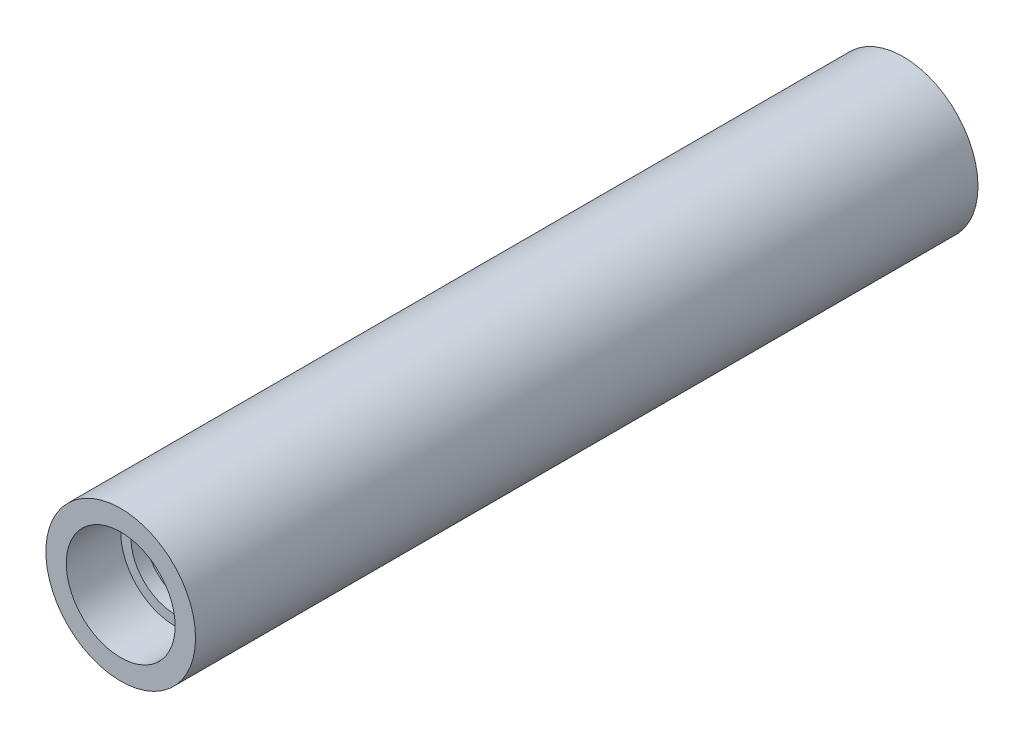
ISO-10303-21;
HEADER;
FILE_DESCRIPTION(('STEP AP214'),'2;1');
FILE_NAME('part.step','',(''),(''),'','','');
FILE_SCHEMA(('AUTOMOTIVE_DESIGN { 1 0 10303 214 1 1 1 1 }'));
ENDSEC;
DATA;
#1=APPLICATION_CONTEXT('core data for automotive mechanical design processes');
#2=APPLICATION_PROTOCOL_DEFINITION('international standard','automotive_design',2000,#1);
#3=PRODUCT_CONTEXT('',#1,'mechanical');
#4=PRODUCT('Part','Part','',(#3));
#5=PRODUCT_RELATED_PRODUCT_CATEGORY('part','',(#4));
#6=PRODUCT_DEFINITION_FORMATION('','',#4);
#7=PRODUCT_DEFINITION_CONTEXT('part definition',#1,'design');
#8=PRODUCT_DEFINITION('design','',#6,#7);
#9=PRODUCT_DEFINITION_SHAPE('','',#8);
#10=(LENGTH_UNIT() NAMED_UNIT(*) SI_UNIT(.MILLI.,.METRE.));
#11=(NAMED_UNIT(*) PLANE_ANGLE_UNIT() SI_UNIT($,.RADIAN.));
#12=(NAMED_UNIT(*) SI_UNIT($,.STERADIAN.) SOLID_ANGLE_UNIT());
#13=UNCERTAINTY_MEASURE_WITH_UNIT(LENGTH_MEASURE(1.E-05),#10,'distance_accuracy_value','');
#14=(GEOMETRIC_REPRESENTATION_CONTEXT(3) GLOBAL_UNCERTAINTY_ASSIGNED_CONTEXT((#13)) GLOBAL_UNIT_ASSIGNED_CONTEXT((#10,
#11,#12)) REPRESENTATION_CONTEXT('',''));
#15=CARTESIAN_POINT('',(0.,0.,0.));
#16=DIRECTION('',(0.,0.,1.));
#17=DIRECTION('',(1.,0.,0.));
#18=AXIS2_PLACEMENT_3D('',#15,#16,#17);
#19=CARTESIAN_POINT('',(0.,0.,57.5));
#20=DIRECTION('',(0.,0.,-1.));
#21=DIRECTION('',(-1.,0.,0.));
#22=AXIS2_PLACEMENT_3D('',#19,#20,#21);
#23=CYLINDRICAL_SURFACE('',#22,8.);
#24=CARTESIAN_POINT('',(0.,0.,47.5));
#25=DIRECTION('',(0.,0.,1.));
#26=DIRECTION('',(1.,0.,0.));
#27=AXIS2_PLACEMENT_3D('',#24,#25,#26);
#28=CIRCLE('',#27,8.);
#29=CARTESIAN_POINT('',(8.,0.,47.5));
#30=VERTEX_POINT('',#29);
#31=EDGE_CURVE('E64',#30,#30,#28,.T.);
#32=ORIENTED_EDGE('',*,*,#31,.T.);
#33=EDGE_LOOP('',(#32));
#34=FACE_BOUND('',#33,.T.);
#35=CARTESIAN_POINT('',(0.,0.,-47.5));
#36=DIRECTION('',(0.,0.,1.));
#37=DIRECTION('',(1.,0.,0.));
#38=AXIS2_PLACEMENT_3D('',#35,#36,#37);
#39=CIRCLE('',#38,8.);
#40=CARTESIAN_POINT('',(8.,0.,-47.5));
#41=VERTEX_POINT('',#40);
#42=EDGE_CURVE('E69',#41,#41,#39,.T.);
#43=ORIENTED_EDGE('',*,*,#42,.F.);
#44=EDGE_LOOP('',(#43));
#45=FACE_BOUND('',#44,.T.);
#46=ADVANCED_FACE('F40',(#34,#45),#23,.F.);
#47=CARTESIAN_POINT('',(0.,0.,-49.5));
#48=DIRECTION('',(0.,0.,-1.));
#49=DIRECTION('',(-1.,0.,0.));
#50=AXIS2_PLACEMENT_3D('',#47,#48,#49);
#51=CIRCLE('',#50,8.);
#52=CARTESIAN_POINT('',(-8.,0.,-49.5));
#53=VERTEX_POINT('',#52);
#54=EDGE_CURVE('E10',#53,#53,#51,.T.);
#55=ORIENTED_EDGE('',*,*,#54,.F.);
#56=EDGE_LOOP('',(#55));
#57=FACE_BOUND('',#56,.T.);
#58=CARTESIAN_POINT('',(0.,0.,-57.5));
#59=DIRECTION('',(0.,0.,1.));
#60=DIRECTION('',(1.,0.,0.));
#61=AXIS2_PLACEMENT_3D('',#58,#59,#60);
#62=CIRCLE('',#61,8.);
#63=CARTESIAN_POINT('',(8.,0.,-57.5));
#64=VERTEX_POINT('',#63);
#65=EDGE_CURVE('E59',#64,#64,#62,.T.);
#66=ORIENTED_EDGE('',*,*,#65,.F.);
#67=EDGE_LOOP('',(#66));
#68=FACE_BOUND('',#67,.T.);
#69=ADVANCED_FACE('F97',(#57,#68),#23,.F.);
#70=CARTESIAN_POINT('',(0.,0.,57.5));
#71=DIRECTION('',(0.,0.,1.));
#72=DIRECTION('',(1.,0.,0.));
#73=AXIS2_PLACEMENT_3D('',#70,#71,#72);
#74=PLANE('',#73);
#75=CARTESIAN_POINT('',(0.,0.,57.5));
#76=DIRECTION('',(0.,0.,1.));
#77=DIRECTION('',(1.,0.,0.));
#78=AXIS2_PLACEMENT_3D('',#75,#76,#77);
#79=CIRCLE('',#78,11.);
#80=CARTESIAN_POINT('',(11.,0.,57.5));
#81=VERTEX_POINT('',#80);
#82=EDGE_CURVE('E48',#81,#81,#79,.T.);
#83=ORIENTED_EDGE('',*,*,#82,.T.);
#84=EDGE_LOOP('',(#83));
#85=FACE_BOUND('',#84,.T.);
#86=CARTESIAN_POINT('',(0.,0.,57.5));
#87=DIRECTION('',(0.,0.,1.));
#88=DIRECTION('',(1.,0.,0.));
#89=AXIS2_PLACEMENT_3D('',#86,#87,#88);
#90=CIRCLE('',#89,8.);
#91=CARTESIAN_POINT('',(8.,0.,57.5));
#92=VERTEX_POINT('',#91);
#93=EDGE_CURVE('E57',#92,#92,#90,.T.);
#94=ORIENTED_EDGE('',*,*,#93,.F.);
#95=EDGE_LOOP('',(#94));
#96=FACE_BOUND('',#95,.T.);
#97=ADVANCED_FACE('F102',(#85,#96),#74,.T.);
#98=CARTESIAN_POINT('',(0.,0.,-57.5));
#99=DIRECTION('',(0.,0.,1.));
#100=DIRECTION('',(1.,0.,0.));
#101=AXIS2_PLACEMENT_3D('',#98,#99,#100);
#102=PLANE('',#101);
#103=CARTESIAN_POINT('',(0.,0.,-57.5));
#104=DIRECTION('',(0.,0.,1.));
#105=DIRECTION('',(1.,0.,0.));
#106=AXIS2_PLACEMENT_3D('',#103,#104,#105);
#107=CIRCLE('',#106,11.);
#108=CARTESIAN_POINT('',(11.,0.,-57.5));
#109=VERTEX_POINT('',#108);
#110=EDGE_CURVE('E55',#109,#109,#107,.T.);
#111=ORIENTED_EDGE('',*,*,#110,.F.);
#112=EDGE_LOOP('',(#111));
#113=FACE_BOUND('',#112,.T.);
#114=ORIENTED_EDGE('',*,*,#65,.T.);
#115=EDGE_LOOP('',(#114));
#116=FACE_BOUND('',#115,.T.);
#117=ADVANCED_FACE('F117',(#113,#116),#102,.F.);
#118=CARTESIAN_POINT('',(0.,0.,57.5));
#119=DIRECTION('',(0.,0.,-1.));
#120=DIRECTION('',(-1.,0.,0.));
#121=AXIS2_PLACEMENT_3D('',#118,#119,#120);
#122=CYLINDRICAL_SURFACE('',#121,11.);
#123=ORIENTED_EDGE('',*,*,#82,.F.);
#124=EDGE_LOOP('',(#123));
#125=FACE_BOUND('',#124,.T.);
#126=ORIENTED_EDGE('',*,*,#110,.T.);
#127=EDGE_LOOP('',(#126));
#128=FACE_BOUND('',#127,.T.);
#129=ADVANCED_FACE('F39',(#125,#128),#122,.T.);
#130=CARTESIAN_POINT('',(0.,0.,49.5));
#131=DIRECTION('',(0.,0.,1.));
#132=DIRECTION('',(1.,0.,0.));
#133=AXIS2_PLACEMENT_3D('',#130,#131,#132);
#134=CIRCLE('',#133,8.);
#135=CARTESIAN_POINT('',(8.,0.,49.5));
#136=VERTEX_POINT('',#135);
#137=EDGE_CURVE('E42',#136,#136,#134,.T.);
#138=ORIENTED_EDGE('',*,*,#137,.F.);
#139=EDGE_LOOP('',(#138));
#140=FACE_BOUND('',#139,.T.);
#141=ORIENTED_EDGE('',*,*,#93,.T.);
#142=EDGE_LOOP('',(#141));
#143=FACE_BOUND('',#142,.T.);
#144=ADVANCED_FACE('F99',(#140,#143),#23,.F.);
#145=CARTESIAN_POINT('',(0.,0.,49.5));
#146=DIRECTION('',(0.,0.,1.));
#147=DIRECTION('',(1.,0.,0.));
#148=AXIS2_PLACEMENT_3D('',#145,#146,#147);
#149=PLANE('',#148);
#150=ORIENTED_EDGE('',*,*,#137,.T.);
#151=EDGE_LOOP('',(#150));
#152=FACE_BOUND('',#151,.T.);
#153=CARTESIAN_POINT('',(0.,0.,49.5));
#154=DIRECTION('',(0.,0.,1.));
#155=DIRECTION('',(1.,0.,0.));
#156=AXIS2_PLACEMENT_3D('',#153,#154,#155);
#157=CIRCLE('',#156,6.5);
#158=CARTESIAN_POINT('',(6.5,0.,49.5));
#159=VERTEX_POINT('',#158);
#160=EDGE_CURVE('E66',#159,#159,#157,.T.);
#161=ORIENTED_EDGE('',*,*,#160,.F.);
#162=EDGE_LOOP('',(#161));
#163=FACE_BOUND('',#162,.T.);
#164=ADVANCED_FACE('F109',(#152,#163),#149,.T.);
#165=CARTESIAN_POINT('',(0.,0.,47.5));
#166=DIRECTION('',(0.,0.,1.));
#167=DIRECTION('',(1.,0.,0.));
#168=AXIS2_PLACEMENT_3D('',#165,#166,#167);
#169=PLANE('',#168);
#170=ORIENTED_EDGE('',*,*,#31,.F.);
#171=EDGE_LOOP('',(#170));
#172=FACE_BOUND('',#171,.T.);
#173=CARTESIAN_POINT('',(0.,0.,47.5));
#174=DIRECTION('',(0.,0.,1.));
#175=DIRECTION('',(1.,0.,0.));
#176=AXIS2_PLACEMENT_3D('',#173,#174,#175);
#177=CIRCLE('',#176,6.5);
#178=CARTESIAN_POINT('',(6.5,0.,47.5));
#179=VERTEX_POINT('',#178);
#180=EDGE_CURVE('E70',#179,#179,#177,.T.);
#181=ORIENTED_EDGE('',*,*,#180,.T.);
#182=EDGE_LOOP('',(#181));
#183=FACE_BOUND('',#182,.T.);
#184=ADVANCED_FACE('F116',(#172,#183),#169,.F.);
#185=CARTESIAN_POINT('',(0.,0.,49.5));
#186=DIRECTION('',(0.,0.,-1.));
#187=DIRECTION('',(-1.,0.,0.));
#188=AXIS2_PLACEMENT_3D('',#185,#186,#187);
#189=CYLINDRICAL_SURFACE('',#188,6.5);
#190=ORIENTED_EDGE('',*,*,#160,.T.);
#191=EDGE_LOOP('',(#190));
#192=FACE_BOUND('',#191,.T.);
#193=ORIENTED_EDGE('',*,*,#180,.F.);
#194=EDGE_LOOP('',(#193));
#195=FACE_BOUND('',#194,.T.);
#196=ADVANCED_FACE('F170',(#192,#195),#189,.F.);
#197=CARTESIAN_POINT('',(0.,0.,-49.5));
#198=DIRECTION('',(0.,0.,-1.));
#199=DIRECTION('',(1.,0.,0.));
#200=AXIS2_PLACEMENT_3D('',#197,#198,#199);
#201=PLANE('',#200);
#202=CARTESIAN_POINT('',(0.,0.,-49.5));
#203=DIRECTION('',(0.,0.,1.));
#204=DIRECTION('',(1.,0.,0.));
#205=AXIS2_PLACEMENT_3D('',#202,#203,#204);
#206=CIRCLE('',#205,6.5);
#207=CARTESIAN_POINT('',(6.5,0.,-49.5));
#208=VERTEX_POINT('',#207);
#209=EDGE_CURVE('E71',#208,#208,#206,.T.);
#210=ORIENTED_EDGE('',*,*,#209,.T.);
#211=EDGE_LOOP('',(#210));
#212=FACE_BOUND('',#211,.T.);
#213=ORIENTED_EDGE('',*,*,#54,.T.);
#214=EDGE_LOOP('',(#213));
#215=FACE_BOUND('',#214,.T.);
#216=ADVANCED_FACE('F81',(#212,#215),#201,.T.);
#217=CARTESIAN_POINT('',(0.,0.,-47.5));
#218=DIRECTION('',(0.,0.,-1.));
#219=DIRECTION('',(1.,0.,0.));
#220=AXIS2_PLACEMENT_3D('',#217,#218,#219);
#221=PLANE('',#220);
#222=CARTESIAN_POINT('',(0.,0.,-47.5));
#223=DIRECTION('',(0.,0.,1.));
#224=DIRECTION('',(1.,0.,0.));
#225=AXIS2_PLACEMENT_3D('',#222,#223,#224);
#226=CIRCLE('',#225,6.5);
#227=CARTESIAN_POINT('',(6.5,0.,-47.5));
#228=VERTEX_POINT('',#227);
#229=EDGE_CURVE('E77',#228,#228,#226,.T.);
#230=ORIENTED_EDGE('',*,*,#229,.F.);
#231=EDGE_LOOP('',(#230));
#232=FACE_BOUND('',#231,.T.);
#233=ORIENTED_EDGE('',*,*,#42,.T.);
#234=EDGE_LOOP('',(#233));
#235=FACE_BOUND('',#234,.T.);
#236=ADVANCED_FACE('F90',(#232,#235),#221,.F.);
#237=CARTESIAN_POINT('',(0.,0.,-49.5));
#238=DIRECTION('',(0.,0.,1.));
#239=DIRECTION('',(1.,0.,0.));
#240=AXIS2_PLACEMENT_3D('',#237,#238,#239);
#241=CYLINDRICAL_SURFACE('',#240,6.5);
#242=ORIENTED_EDGE('',*,*,#209,.F.);
#243=EDGE_LOOP('',(#242));
#244=FACE_BOUND('',#243,.T.);
#245=ORIENTED_EDGE('',*,*,#229,.T.);
#246=EDGE_LOOP('',(#245));
#247=FACE_BOUND('',#246,.T.);
#248=ADVANCED_FACE('F83',(#244,#247),#241,.F.);
#249=CLOSED_SHELL('',(#46,#69,#97,#117,#129,#144,#164,#184,#196,#216,#236,#248));
#250=MANIFOLD_SOLID_BREP('B2',#249);
#251=ADVANCED_BREP_SHAPE_REPRESENTATION('',(#18,#250),#14);
#252=SHAPE_DEFINITION_REPRESENTATION(#9,#251);
ENDSEC;
END-ISO-10303-21;
